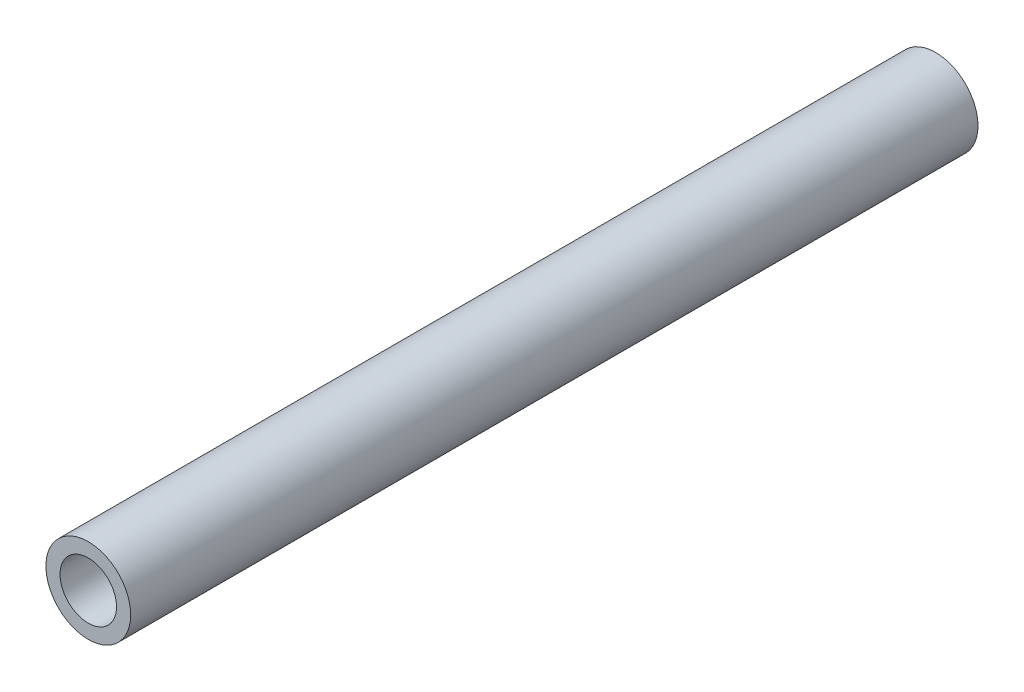
ISO-10303-21;
HEADER;
FILE_DESCRIPTION(('STEP AP214'),'2;1');
FILE_NAME('part.step','',(''),(''),'','','');
FILE_SCHEMA(('AUTOMOTIVE_DESIGN { 1 0 10303 214 1 1 1 1 }'));
ENDSEC;
DATA;
#1=APPLICATION_CONTEXT('core data for automotive mechanical design processes');
#2=APPLICATION_PROTOCOL_DEFINITION('international standard','automotive_design',2000,#1);
#3=PRODUCT_CONTEXT('',#1,'mechanical');
#4=PRODUCT('Part','Part','',(#3));
#5=PRODUCT_RELATED_PRODUCT_CATEGORY('part','',(#4));
#6=PRODUCT_DEFINITION_FORMATION('','',#4);
#7=PRODUCT_DEFINITION_CONTEXT('part definition',#1,'design');
#8=PRODUCT_DEFINITION('design','',#6,#7);
#9=PRODUCT_DEFINITION_SHAPE('','',#8);
#10=(LENGTH_UNIT() NAMED_UNIT(*) SI_UNIT(.MILLI.,.METRE.));
#11=(NAMED_UNIT(*) PLANE_ANGLE_UNIT() SI_UNIT($,.RADIAN.));
#12=(NAMED_UNIT(*) SI_UNIT($,.STERADIAN.) SOLID_ANGLE_UNIT());
#13=UNCERTAINTY_MEASURE_WITH_UNIT(LENGTH_MEASURE(1.E-05),#10,'distance_accuracy_value','');
#14=(GEOMETRIC_REPRESENTATION_CONTEXT(3) GLOBAL_UNCERTAINTY_ASSIGNED_CONTEXT((#13)) GLOBAL_UNIT_ASSIGNED_CONTEXT((#10,
#11,#12)) REPRESENTATION_CONTEXT('',''));
#15=CARTESIAN_POINT('',(0.,0.,0.));
#16=DIRECTION('',(0.,0.,1.));
#17=DIRECTION('',(1.,0.,0.));
#18=AXIS2_PLACEMENT_3D('',#15,#16,#17);
#19=CARTESIAN_POINT('',(-0.992203805522902,0.0115180334406377,30.));
#20=DIRECTION('',(0.,0.,1.));
#21=DIRECTION('',(1.,0.,0.));
#22=AXIS2_PLACEMENT_3D('',#19,#20,#21);
#23=PLANE('',#22);
#24=CARTESIAN_POINT('',(-0.992203805522902,0.0115180334406377,30.));
#25=DIRECTION('',(0.,0.,1.));
#26=DIRECTION('',(1.,0.,0.));
#27=AXIS2_PLACEMENT_3D('',#24,#25,#26);
#28=CIRCLE('',#27,1.5);
#29=CARTESIAN_POINT('',(0.507796194477098,0.0115180334406377,30.));
#30=VERTEX_POINT('',#29);
#31=EDGE_CURVE('E10',#30,#30,#28,.T.);
#32=ORIENTED_EDGE('',*,*,#31,.T.);
#33=EDGE_LOOP('',(#32));
#34=FACE_BOUND('',#33,.T.);
#35=CARTESIAN_POINT('',(-0.992203805522902,0.0115180334406377,30.));
#36=DIRECTION('',(0.,0.,1.));
#37=DIRECTION('',(1.,0.,0.));
#38=AXIS2_PLACEMENT_3D('',#35,#36,#37);
#39=CIRCLE('',#38,1.);
#40=CARTESIAN_POINT('',(0.00779619447709764,0.0115180334406377,30.));
#41=VERTEX_POINT('',#40);
#42=EDGE_CURVE('E42',#41,#41,#39,.T.);
#43=ORIENTED_EDGE('',*,*,#42,.F.);
#44=EDGE_LOOP('',(#43));
#45=FACE_BOUND('',#44,.T.);
#46=ADVANCED_FACE('F31',(#34,#45),#23,.T.);
#47=CARTESIAN_POINT('',(-0.992203805522902,0.0115180334406377,0.));
#48=DIRECTION('',(0.,0.,1.));
#49=DIRECTION('',(1.,0.,0.));
#50=AXIS2_PLACEMENT_3D('',#47,#48,#49);
#51=PLANE('',#50);
#52=CARTESIAN_POINT('',(-0.992203805522902,0.0115180334406377,0.));
#53=DIRECTION('',(0.,0.,1.));
#54=DIRECTION('',(1.,0.,0.));
#55=AXIS2_PLACEMENT_3D('',#52,#53,#54);
#56=CIRCLE('',#55,1.5);
#57=CARTESIAN_POINT('',(0.507796194477098,0.0115180334406377,0.));
#58=VERTEX_POINT('',#57);
#59=EDGE_CURVE('E35',#58,#58,#56,.T.);
#60=ORIENTED_EDGE('',*,*,#59,.F.);
#61=EDGE_LOOP('',(#60));
#62=FACE_BOUND('',#61,.T.);
#63=CARTESIAN_POINT('',(-0.992203805522902,0.0115180334406377,0.));
#64=DIRECTION('',(0.,0.,1.));
#65=DIRECTION('',(1.,0.,0.));
#66=AXIS2_PLACEMENT_3D('',#63,#64,#65);
#67=CIRCLE('',#66,1.);
#68=CARTESIAN_POINT('',(0.00779619447709764,0.0115180334406377,0.));
#69=VERTEX_POINT('',#68);
#70=EDGE_CURVE('E44',#69,#69,#67,.T.);
#71=ORIENTED_EDGE('',*,*,#70,.T.);
#72=EDGE_LOOP('',(#71));
#73=FACE_BOUND('',#72,.T.);
#74=ADVANCED_FACE('F54',(#62,#73),#51,.F.);
#75=CARTESIAN_POINT('',(-0.992203805522902,0.0115180334406377,30.));
#76=DIRECTION('',(0.,0.,-1.));
#77=DIRECTION('',(-1.,0.,0.));
#78=AXIS2_PLACEMENT_3D('',#75,#76,#77);
#79=CYLINDRICAL_SURFACE('',#78,1.5);
#80=ORIENTED_EDGE('',*,*,#31,.F.);
#81=EDGE_LOOP('',(#80));
#82=FACE_BOUND('',#81,.T.);
#83=ORIENTED_EDGE('',*,*,#59,.T.);
#84=EDGE_LOOP('',(#83));
#85=FACE_BOUND('',#84,.T.);
#86=ADVANCED_FACE('F33',(#82,#85),#79,.T.);
#87=CARTESIAN_POINT('',(-0.992203805522902,0.0115180334406377,30.));
#88=DIRECTION('',(0.,0.,-1.));
#89=DIRECTION('',(-1.,0.,0.));
#90=AXIS2_PLACEMENT_3D('',#87,#88,#89);
#91=CYLINDRICAL_SURFACE('',#90,1.);
#92=ORIENTED_EDGE('',*,*,#42,.T.);
#93=EDGE_LOOP('',(#92));
#94=FACE_BOUND('',#93,.T.);
#95=ORIENTED_EDGE('',*,*,#70,.F.);
#96=EDGE_LOOP('',(#95));
#97=FACE_BOUND('',#96,.T.);
#98=ADVANCED_FACE('F50',(#94,#97),#91,.F.);
#99=CLOSED_SHELL('',(#46,#74,#86,#98));
#100=MANIFOLD_SOLID_BREP('B2',#99);
#101=ADVANCED_BREP_SHAPE_REPRESENTATION('',(#18,#100),#14);
#102=SHAPE_DEFINITION_REPRESENTATION(#9,#101);
ENDSEC;
END-ISO-10303-21;
